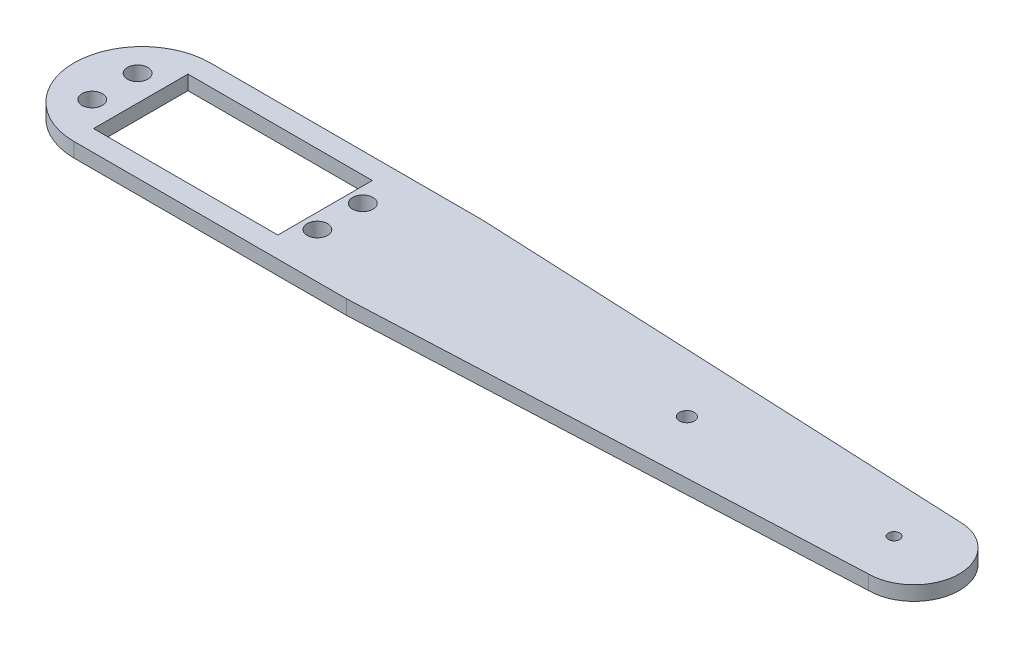
ISO-10303-21;
HEADER;
FILE_DESCRIPTION(('STEP AP214'),'2;1');
FILE_NAME('part.step','',(''),(''),'','','');
FILE_SCHEMA(('AUTOMOTIVE_DESIGN { 1 0 10303 214 1 1 1 1 }'));
ENDSEC;
DATA;
#1=APPLICATION_CONTEXT('core data for automotive mechanical design processes');
#2=APPLICATION_PROTOCOL_DEFINITION('international standard','automotive_design',2000,#1);
#3=PRODUCT_CONTEXT('',#1,'mechanical');
#4=PRODUCT('Part','Part','',(#3));
#5=PRODUCT_RELATED_PRODUCT_CATEGORY('part','',(#4));
#6=PRODUCT_DEFINITION_FORMATION('','',#4);
#7=PRODUCT_DEFINITION_CONTEXT('part definition',#1,'design');
#8=PRODUCT_DEFINITION('design','',#6,#7);
#9=PRODUCT_DEFINITION_SHAPE('','',#8);
#10=(LENGTH_UNIT() NAMED_UNIT(*) SI_UNIT(.MILLI.,.METRE.));
#11=(NAMED_UNIT(*) PLANE_ANGLE_UNIT() SI_UNIT($,.RADIAN.));
#12=(NAMED_UNIT(*) SI_UNIT($,.STERADIAN.) SOLID_ANGLE_UNIT());
#13=UNCERTAINTY_MEASURE_WITH_UNIT(LENGTH_MEASURE(1.E-05),#10,'distance_accuracy_value','');
#14=(GEOMETRIC_REPRESENTATION_CONTEXT(3) GLOBAL_UNCERTAINTY_ASSIGNED_CONTEXT((#13)) GLOBAL_UNIT_ASSIGNED_CONTEXT((#10,
#11,#12)) REPRESENTATION_CONTEXT('',''));
#15=CARTESIAN_POINT('',(0.,0.,0.));
#16=DIRECTION('',(0.,0.,1.));
#17=DIRECTION('',(1.,0.,0.));
#18=AXIS2_PLACEMENT_3D('',#15,#16,#17);
#19=CARTESIAN_POINT('',(-162.387355879804,3.175,-2.24465289077099));
#20=DIRECTION('',(0.,1.,0.));
#21=DIRECTION('',(0.,0.,1.));
#22=AXIS2_PLACEMENT_3D('',#19,#20,#21);
#23=PLANE('',#22);
#24=CARTESIAN_POINT('',(3.2376441201965,3.175,-2.24631068209401));
#25=DIRECTION('',(0.,1.,0.));
#26=DIRECTION('',(0.,0.,1.));
#27=AXIS2_PLACEMENT_3D('',#24,#25,#26);
#28=CIRCLE('',#27,1.25282432984258);
#29=CARTESIAN_POINT('',(3.2376441201965,3.175,-0.993486352251428));
#30=VERTEX_POINT('',#29);
#31=EDGE_CURVE('E283',#30,#30,#28,.T.);
#32=ORIENTED_EDGE('',*,*,#31,.F.);
#33=EDGE_LOOP('',(#32));
#34=FACE_BOUND('',#33,.T.);
#35=CARTESIAN_POINT('',(-118.787355879804,3.175,-7.24465289077099));
#36=DIRECTION('',(0.,1.,0.));
#37=DIRECTION('',(0.,0.,1.));
#38=AXIS2_PLACEMENT_3D('',#35,#36,#37);
#39=CIRCLE('',#38,2.25);
#40=CARTESIAN_POINT('',(-118.787355879804,3.175,-4.994652890771));
#41=VERTEX_POINT('',#40);
#42=EDGE_CURVE('E295',#41,#41,#39,.T.);
#43=ORIENTED_EDGE('',*,*,#42,.F.);
#44=EDGE_LOOP('',(#43));
#45=FACE_BOUND('',#44,.T.);
#46=CARTESIAN_POINT('',(-168.387355879804,3.175,2.75534710922901));
#47=DIRECTION('',(0.,1.,0.));
#48=DIRECTION('',(0.,0.,1.));
#49=AXIS2_PLACEMENT_3D('',#46,#47,#48);
#50=CIRCLE('',#49,2.25000000000001);
#51=CARTESIAN_POINT('',(-168.387355879804,3.175,5.00534710922902));
#52=VERTEX_POINT('',#51);
#53=EDGE_CURVE('E141',#52,#52,#50,.T.);
#54=ORIENTED_EDGE('',*,*,#53,.F.);
#55=EDGE_LOOP('',(#54));
#56=FACE_BOUND('',#55,.T.);
#57=CARTESIAN_POINT('',(-162.387355879804,3.175,-2.24465289077099));
#58=DIRECTION('',(0.,1.,0.));
#59=DIRECTION('',(0.,0.,1.));
#60=AXIS2_PLACEMENT_3D('',#57,#58,#59);
#61=CIRCLE('',#60,15.);
#62=CARTESIAN_POINT('',(-162.387355879804,3.175,-17.244652890771));
#63=VERTEX_POINT('',#62);
#64=CARTESIAN_POINT('',(-162.387355879804,3.175,12.755347109229));
#65=VERTEX_POINT('',#64);
#66=EDGE_CURVE('E151',#63,#65,#61,.T.);
#67=ORIENTED_EDGE('',*,*,#66,.T.);
#68=DIRECTION('',(1.,0.,0.));
#69=VECTOR('',#68,1.);
#70=CARTESIAN_POINT('',(-162.387355879804,3.175,12.755347109229));
#71=LINE('',#70,#69);
#72=CARTESIAN_POINT('',(-102.387355879804,3.175,12.755347109229));
#73=VERTEX_POINT('',#72);
#74=EDGE_CURVE('E154',#65,#73,#71,.T.);
#75=ORIENTED_EDGE('',*,*,#74,.T.);
#76=DIRECTION('',(0.9989685402103,0.,-0.04540766091865));
#77=VECTOR('',#76,1.);
#78=CARTESIAN_POINT('',(-102.387355879804,3.175,12.755347109229));
#79=LINE('',#78,#77);
#80=CARTESIAN_POINT('',(7.61264412019603,3.175,7.75534710922901));
#81=VERTEX_POINT('',#80);
#82=EDGE_CURVE('E157',#73,#81,#79,.T.);
#83=ORIENTED_EDGE('',*,*,#82,.T.);
#84=CARTESIAN_POINT('',(7.61264412019603,3.175,-2.24465289077099));
#85=DIRECTION('',(0.,1.,0.));
#86=DIRECTION('',(0.,0.,1.));
#87=AXIS2_PLACEMENT_3D('',#84,#85,#86);
#88=CIRCLE('',#87,10.);
#89=CARTESIAN_POINT('',(7.61264412019603,3.175,-12.244652890771));
#90=VERTEX_POINT('',#89);
#91=EDGE_CURVE('E159',#81,#90,#88,.T.);
#92=ORIENTED_EDGE('',*,*,#91,.T.);
#93=DIRECTION('',(-0.998968540210299,0.,-0.04540766091865));
#94=VECTOR('',#93,1.);
#95=CARTESIAN_POINT('',(-102.387355879804,3.175,-17.244652890771));
#96=LINE('',#95,#94);
#97=CARTESIAN_POINT('',(-102.387355879804,3.175,-17.244652890771));
#98=VERTEX_POINT('',#97);
#99=EDGE_CURVE('E161',#90,#98,#96,.T.);
#100=ORIENTED_EDGE('',*,*,#99,.T.);
#101=DIRECTION('',(-1.,0.,0.));
#102=VECTOR('',#101,1.);
#103=CARTESIAN_POINT('',(-162.387355879804,3.175,-17.244652890771));
#104=LINE('',#103,#102);
#105=EDGE_CURVE('E163',#98,#63,#104,.T.);
#106=ORIENTED_EDGE('',*,*,#105,.T.);
#107=EDGE_LOOP('',(#67,#75,#83,#92,#100,#106));
#108=FACE_BOUND('',#107,.T.);
#109=DIRECTION('',(1.,0.,0.));
#110=VECTOR('',#109,1.);
#111=CARTESIAN_POINT('',(-162.692621678717,3.175,8.15534710922901));
#112=LINE('',#111,#110);
#113=CARTESIAN_POINT('',(-162.692621678717,3.175,8.15534710922901));
#114=VERTEX_POINT('',#113);
#115=CARTESIAN_POINT('',(-122.092621678717,3.175,8.15534710922901));
#116=VERTEX_POINT('',#115);
#117=EDGE_CURVE('E120',#114,#116,#112,.T.);
#118=ORIENTED_EDGE('',*,*,#117,.F.);
#119=DIRECTION('',(0.,0.,1.));
#120=VECTOR('',#119,1.);
#121=CARTESIAN_POINT('',(-162.692621678717,3.175,8.15534710922901));
#122=LINE('',#121,#120);
#123=CARTESIAN_POINT('',(-162.692621678717,3.175,-12.644652890771));
#124=VERTEX_POINT('',#123);
#125=EDGE_CURVE('E112',#124,#114,#122,.T.);
#126=ORIENTED_EDGE('',*,*,#125,.F.);
#127=DIRECTION('',(-1.,0.,0.));
#128=VECTOR('',#127,1.);
#129=CARTESIAN_POINT('',(-162.692621678717,3.175,-12.644652890771));
#130=LINE('',#129,#128);
#131=CARTESIAN_POINT('',(-122.092621678717,3.175,-12.644652890771));
#132=VERTEX_POINT('',#131);
#133=EDGE_CURVE('E135',#132,#124,#130,.T.);
#134=ORIENTED_EDGE('',*,*,#133,.F.);
#135=DIRECTION('',(0.,0.,-1.));
#136=VECTOR('',#135,1.);
#137=CARTESIAN_POINT('',(-122.092621678717,3.175,8.15534710922901));
#138=LINE('',#137,#136);
#139=EDGE_CURVE('E133',#116,#132,#138,.T.);
#140=ORIENTED_EDGE('',*,*,#139,.F.);
#141=EDGE_LOOP('',(#118,#126,#134,#140));
#142=FACE_BOUND('',#141,.T.);
#143=CARTESIAN_POINT('',(-168.387355879804,3.175,-7.24465289077099));
#144=DIRECTION('',(0.,1.,0.));
#145=DIRECTION('',(0.,0.,1.));
#146=AXIS2_PLACEMENT_3D('',#143,#144,#145);
#147=CIRCLE('',#146,2.25000000000001);
#148=CARTESIAN_POINT('',(-168.387355879804,3.175,-4.99465289077098));
#149=VERTEX_POINT('',#148);
#150=EDGE_CURVE('E301',#149,#149,#147,.T.);
#151=ORIENTED_EDGE('',*,*,#150,.F.);
#152=EDGE_LOOP('',(#151));
#153=FACE_BOUND('',#152,.T.);
#154=CARTESIAN_POINT('',(-118.787355879804,3.175,2.75534710922901));
#155=DIRECTION('',(0.,1.,0.));
#156=DIRECTION('',(0.,0.,1.));
#157=AXIS2_PLACEMENT_3D('',#154,#155,#156);
#158=CIRCLE('',#157,2.25);
#159=CARTESIAN_POINT('',(-118.787355879804,3.175,5.00534710922901));
#160=VERTEX_POINT('',#159);
#161=EDGE_CURVE('E289',#160,#160,#158,.T.);
#162=ORIENTED_EDGE('',*,*,#161,.F.);
#163=EDGE_LOOP('',(#162));
#164=FACE_BOUND('',#163,.T.);
#165=CARTESIAN_POINT('',(-42.387355879804,3.175,-2.24465289077099));
#166=DIRECTION('',(0.,1.,0.));
#167=DIRECTION('',(0.,0.,1.));
#168=AXIS2_PLACEMENT_3D('',#165,#166,#167);
#169=CIRCLE('',#168,1.65);
#170=CARTESIAN_POINT('',(-42.387355879804,3.175,-0.594652890770989));
#171=VERTEX_POINT('',#170);
#172=EDGE_CURVE('E274',#171,#171,#169,.T.);
#173=ORIENTED_EDGE('',*,*,#172,.F.);
#174=EDGE_LOOP('',(#173));
#175=FACE_BOUND('',#174,.T.);
#176=ADVANCED_FACE('F35',(#34,#45,#56,#108,#142,#153,#164,#175),#23,.T.);
#177=CARTESIAN_POINT('',(-162.387355879804,0.,-2.24465289077099));
#178=DIRECTION('',(0.,1.,0.));
#179=DIRECTION('',(0.,0.,1.));
#180=AXIS2_PLACEMENT_3D('',#177,#178,#179);
#181=PLANE('',#180);
#182=CARTESIAN_POINT('',(-162.387355879804,0.,-2.24465289077099));
#183=DIRECTION('',(0.,1.,0.));
#184=DIRECTION('',(0.,0.,1.));
#185=AXIS2_PLACEMENT_3D('',#182,#183,#184);
#186=CIRCLE('',#185,15.);
#187=CARTESIAN_POINT('',(-162.387355879804,0.,-17.244652890771));
#188=VERTEX_POINT('',#187);
#189=CARTESIAN_POINT('',(-162.387355879804,0.,12.755347109229));
#190=VERTEX_POINT('',#189);
#191=EDGE_CURVE('E128',#188,#190,#186,.T.);
#192=ORIENTED_EDGE('',*,*,#191,.F.);
#193=DIRECTION('',(-1.,0.,0.));
#194=VECTOR('',#193,1.);
#195=CARTESIAN_POINT('',(-162.387355879804,0.,-17.244652890771));
#196=LINE('',#195,#194);
#197=CARTESIAN_POINT('',(-102.387355879804,0.,-17.244652890771));
#198=VERTEX_POINT('',#197);
#199=EDGE_CURVE('E155',#198,#188,#196,.T.);
#200=ORIENTED_EDGE('',*,*,#199,.F.);
#201=DIRECTION('',(-0.998968540210299,0.,-0.04540766091865));
#202=VECTOR('',#201,1.);
#203=CARTESIAN_POINT('',(-102.387355879804,0.,-17.244652890771));
#204=LINE('',#203,#202);
#205=CARTESIAN_POINT('',(7.61264412019603,0.,-12.244652890771));
#206=VERTEX_POINT('',#205);
#207=EDGE_CURVE('E174',#206,#198,#204,.T.);
#208=ORIENTED_EDGE('',*,*,#207,.F.);
#209=CARTESIAN_POINT('',(7.61264412019603,0.,-2.24465289077099));
#210=DIRECTION('',(0.,1.,0.));
#211=DIRECTION('',(0.,0.,1.));
#212=AXIS2_PLACEMENT_3D('',#209,#210,#211);
#213=CIRCLE('',#212,10.);
#214=CARTESIAN_POINT('',(7.61264412019603,0.,7.75534710922901));
#215=VERTEX_POINT('',#214);
#216=EDGE_CURVE('E172',#215,#206,#213,.T.);
#217=ORIENTED_EDGE('',*,*,#216,.F.);
#218=DIRECTION('',(0.9989685402103,0.,-0.04540766091865));
#219=VECTOR('',#218,1.);
#220=CARTESIAN_POINT('',(-102.387355879804,0.,12.755347109229));
#221=LINE('',#220,#219);
#222=CARTESIAN_POINT('',(-102.387355879804,0.,12.755347109229));
#223=VERTEX_POINT('',#222);
#224=EDGE_CURVE('E170',#223,#215,#221,.T.);
#225=ORIENTED_EDGE('',*,*,#224,.F.);
#226=DIRECTION('',(1.,0.,0.));
#227=VECTOR('',#226,1.);
#228=CARTESIAN_POINT('',(-162.387355879804,0.,12.755347109229));
#229=LINE('',#228,#227);
#230=EDGE_CURVE('E168',#190,#223,#229,.T.);
#231=ORIENTED_EDGE('',*,*,#230,.F.);
#232=EDGE_LOOP('',(#192,#200,#208,#217,#225,#231));
#233=FACE_BOUND('',#232,.T.);
#234=DIRECTION('',(0.,0.,1.));
#235=VECTOR('',#234,1.);
#236=CARTESIAN_POINT('',(-162.692621678717,0.,8.15534710922901));
#237=LINE('',#236,#235);
#238=CARTESIAN_POINT('',(-162.692621678717,0.,-12.644652890771));
#239=VERTEX_POINT('',#238);
#240=CARTESIAN_POINT('',(-162.692621678717,0.,8.15534710922901));
#241=VERTEX_POINT('',#240);
#242=EDGE_CURVE('E58',#239,#241,#237,.T.);
#243=ORIENTED_EDGE('',*,*,#242,.T.);
#244=DIRECTION('',(1.,0.,0.));
#245=VECTOR('',#244,1.);
#246=CARTESIAN_POINT('',(-162.692621678717,0.,8.15534710922901));
#247=LINE('',#246,#245);
#248=CARTESIAN_POINT('',(-122.092621678717,0.,8.15534710922901));
#249=VERTEX_POINT('',#248);
#250=EDGE_CURVE('E127',#241,#249,#247,.T.);
#251=ORIENTED_EDGE('',*,*,#250,.T.);
#252=DIRECTION('',(0.,0.,-1.));
#253=VECTOR('',#252,1.);
#254=CARTESIAN_POINT('',(-122.092621678717,0.,8.15534710922901));
#255=LINE('',#254,#253);
#256=CARTESIAN_POINT('',(-122.092621678717,0.,-12.644652890771));
#257=VERTEX_POINT('',#256);
#258=EDGE_CURVE('E143',#249,#257,#255,.T.);
#259=ORIENTED_EDGE('',*,*,#258,.T.);
#260=DIRECTION('',(-1.,0.,0.));
#261=VECTOR('',#260,1.);
#262=CARTESIAN_POINT('',(-162.692621678717,0.,-12.644652890771));
#263=LINE('',#262,#261);
#264=EDGE_CURVE('E121',#257,#239,#263,.T.);
#265=ORIENTED_EDGE('',*,*,#264,.T.);
#266=EDGE_LOOP('',(#243,#251,#259,#265));
#267=FACE_BOUND('',#266,.T.);
#268=CARTESIAN_POINT('',(-168.387355879804,0.,2.75534710922901));
#269=DIRECTION('',(0.,1.,0.));
#270=DIRECTION('',(0.,0.,1.));
#271=AXIS2_PLACEMENT_3D('',#268,#269,#270);
#272=CIRCLE('',#271,2.25000000000001);
#273=CARTESIAN_POINT('',(-168.387355879804,0.,5.00534710922902));
#274=VERTEX_POINT('',#273);
#275=EDGE_CURVE('E304',#274,#274,#272,.T.);
#276=ORIENTED_EDGE('',*,*,#275,.T.);
#277=EDGE_LOOP('',(#276));
#278=FACE_BOUND('',#277,.T.);
#279=CARTESIAN_POINT('',(-168.387355879804,0.,-7.24465289077099));
#280=DIRECTION('',(0.,1.,0.));
#281=DIRECTION('',(0.,0.,1.));
#282=AXIS2_PLACEMENT_3D('',#279,#280,#281);
#283=CIRCLE('',#282,2.25000000000001);
#284=CARTESIAN_POINT('',(-168.387355879804,0.,-4.99465289077098));
#285=VERTEX_POINT('',#284);
#286=EDGE_CURVE('E298',#285,#285,#283,.T.);
#287=ORIENTED_EDGE('',*,*,#286,.T.);
#288=EDGE_LOOP('',(#287));
#289=FACE_BOUND('',#288,.T.);
#290=CARTESIAN_POINT('',(-118.787355879804,0.,-7.24465289077099));
#291=DIRECTION('',(0.,1.,0.));
#292=DIRECTION('',(0.,0.,1.));
#293=AXIS2_PLACEMENT_3D('',#290,#291,#292);
#294=CIRCLE('',#293,2.25);
#295=CARTESIAN_POINT('',(-118.787355879804,0.,-4.994652890771));
#296=VERTEX_POINT('',#295);
#297=EDGE_CURVE('E292',#296,#296,#294,.T.);
#298=ORIENTED_EDGE('',*,*,#297,.T.);
#299=EDGE_LOOP('',(#298));
#300=FACE_BOUND('',#299,.T.);
#301=CARTESIAN_POINT('',(-118.787355879804,0.,2.75534710922901));
#302=DIRECTION('',(0.,1.,0.));
#303=DIRECTION('',(0.,0.,1.));
#304=AXIS2_PLACEMENT_3D('',#301,#302,#303);
#305=CIRCLE('',#304,2.25);
#306=CARTESIAN_POINT('',(-118.787355879804,0.,5.00534710922901));
#307=VERTEX_POINT('',#306);
#308=EDGE_CURVE('E286',#307,#307,#305,.T.);
#309=ORIENTED_EDGE('',*,*,#308,.T.);
#310=EDGE_LOOP('',(#309));
#311=FACE_BOUND('',#310,.T.);
#312=CARTESIAN_POINT('',(3.2376441201965,0.,-2.24631068209401));
#313=DIRECTION('',(0.,1.,0.));
#314=DIRECTION('',(0.,0.,1.));
#315=AXIS2_PLACEMENT_3D('',#312,#313,#314);
#316=CIRCLE('',#315,1.25282432984258);
#317=CARTESIAN_POINT('',(3.2376441201965,0.,-0.993486352251428));
#318=VERTEX_POINT('',#317);
#319=EDGE_CURVE('E280',#318,#318,#316,.T.);
#320=ORIENTED_EDGE('',*,*,#319,.T.);
#321=EDGE_LOOP('',(#320));
#322=FACE_BOUND('',#321,.T.);
#323=CARTESIAN_POINT('',(-42.387355879804,0.,-2.24465289077099));
#324=DIRECTION('',(0.,1.,0.));
#325=DIRECTION('',(0.,0.,1.));
#326=AXIS2_PLACEMENT_3D('',#323,#324,#325);
#327=CIRCLE('',#326,1.65);
#328=CARTESIAN_POINT('',(-42.387355879804,0.,-0.594652890770989));
#329=VERTEX_POINT('',#328);
#330=EDGE_CURVE('E277',#329,#329,#327,.T.);
#331=ORIENTED_EDGE('',*,*,#330,.T.);
#332=EDGE_LOOP('',(#331));
#333=FACE_BOUND('',#332,.T.);
#334=ADVANCED_FACE('F198',(#233,#267,#278,#289,#300,#311,#322,#333),#181,.F.);
#335=CARTESIAN_POINT('',(-162.387355879804,3.175,-2.24465289077099));
#336=DIRECTION('',(0.,-1.,0.));
#337=DIRECTION('',(0.,0.,-1.));
#338=AXIS2_PLACEMENT_3D('',#335,#336,#337);
#339=CYLINDRICAL_SURFACE('',#338,15.);
#340=ORIENTED_EDGE('',*,*,#191,.T.);
#341=DIRECTION('',(0.,-1.,0.));
#342=VECTOR('',#341,1.);
#343=CARTESIAN_POINT('',(-162.387355879804,3.175,12.755347109229));
#344=LINE('',#343,#342);
#345=EDGE_CURVE('E11',#65,#190,#344,.T.);
#346=ORIENTED_EDGE('',*,*,#345,.F.);
#347=ORIENTED_EDGE('',*,*,#66,.F.);
#348=DIRECTION('',(0.,-1.,0.));
#349=VECTOR('',#348,1.);
#350=CARTESIAN_POINT('',(-162.387355879804,3.175,-17.244652890771));
#351=LINE('',#350,#349);
#352=EDGE_CURVE('E165',#63,#188,#351,.T.);
#353=ORIENTED_EDGE('',*,*,#352,.T.);
#354=EDGE_LOOP('',(#340,#346,#347,#353));
#355=FACE_BOUND('',#354,.T.);
#356=ADVANCED_FACE('F37',(#355),#339,.T.);
#357=CARTESIAN_POINT('',(-162.387355879804,3.175,12.755347109229));
#358=DIRECTION('',(0.,0.,-1.));
#359=DIRECTION('',(-1.,0.,0.));
#360=AXIS2_PLACEMENT_3D('',#357,#358,#359);
#361=PLANE('',#360);
#362=ORIENTED_EDGE('',*,*,#230,.T.);
#363=DIRECTION('',(0.,-1.,0.));
#364=VECTOR('',#363,1.);
#365=CARTESIAN_POINT('',(-102.387355879804,3.175,12.755347109229));
#366=LINE('',#365,#364);
#367=EDGE_CURVE('E43',#73,#223,#366,.T.);
#368=ORIENTED_EDGE('',*,*,#367,.F.);
#369=ORIENTED_EDGE('',*,*,#74,.F.);
#370=ORIENTED_EDGE('',*,*,#345,.T.);
#371=EDGE_LOOP('',(#362,#368,#369,#370));
#372=FACE_BOUND('',#371,.T.);
#373=ADVANCED_FACE('F215',(#372),#361,.F.);
#374=CARTESIAN_POINT('',(-102.387355879804,3.175,12.755347109229));
#375=DIRECTION('',(-0.04540766091865,0.,-0.9989685402103));
#376=DIRECTION('',(-0.9989685402103,0.,0.04540766091865));
#377=AXIS2_PLACEMENT_3D('',#374,#375,#376);
#378=PLANE('',#377);
#379=ORIENTED_EDGE('',*,*,#224,.T.);
#380=DIRECTION('',(0.,-1.,0.));
#381=VECTOR('',#380,1.);
#382=CARTESIAN_POINT('',(7.61264412019603,3.175,7.75534710922901));
#383=LINE('',#382,#381);
#384=EDGE_CURVE('E185',#81,#215,#383,.T.);
#385=ORIENTED_EDGE('',*,*,#384,.F.);
#386=ORIENTED_EDGE('',*,*,#82,.F.);
#387=ORIENTED_EDGE('',*,*,#367,.T.);
#388=EDGE_LOOP('',(#379,#385,#386,#387));
#389=FACE_BOUND('',#388,.T.);
#390=ADVANCED_FACE('F192',(#389),#378,.F.);
#391=CARTESIAN_POINT('',(7.61264412019603,3.175,-2.24465289077099));
#392=DIRECTION('',(0.,-1.,0.));
#393=DIRECTION('',(0.,0.,-1.));
#394=AXIS2_PLACEMENT_3D('',#391,#392,#393);
#395=CYLINDRICAL_SURFACE('',#394,10.);
#396=ORIENTED_EDGE('',*,*,#216,.T.);
#397=DIRECTION('',(0.,-1.,0.));
#398=VECTOR('',#397,1.);
#399=CARTESIAN_POINT('',(7.61264412019603,3.175,-12.244652890771));
#400=LINE('',#399,#398);
#401=EDGE_CURVE('E182',#90,#206,#400,.T.);
#402=ORIENTED_EDGE('',*,*,#401,.F.);
#403=ORIENTED_EDGE('',*,*,#91,.F.);
#404=ORIENTED_EDGE('',*,*,#384,.T.);
#405=EDGE_LOOP('',(#396,#402,#403,#404));
#406=FACE_BOUND('',#405,.T.);
#407=ADVANCED_FACE('F204',(#406),#395,.T.);
#408=CARTESIAN_POINT('',(-102.387355879804,3.175,-17.244652890771));
#409=DIRECTION('',(-0.04540766091865,0.,0.9989685402103));
#410=DIRECTION('',(0.9989685402103,0.,0.04540766091865));
#411=AXIS2_PLACEMENT_3D('',#408,#409,#410);
#412=PLANE('',#411);
#413=ORIENTED_EDGE('',*,*,#207,.T.);
#414=DIRECTION('',(0.,-1.,0.));
#415=VECTOR('',#414,1.);
#416=CARTESIAN_POINT('',(-102.387355879804,3.175,-17.244652890771));
#417=LINE('',#416,#415);
#418=EDGE_CURVE('E179',#98,#198,#417,.T.);
#419=ORIENTED_EDGE('',*,*,#418,.F.);
#420=ORIENTED_EDGE('',*,*,#99,.F.);
#421=ORIENTED_EDGE('',*,*,#401,.T.);
#422=EDGE_LOOP('',(#413,#419,#420,#421));
#423=FACE_BOUND('',#422,.T.);
#424=ADVANCED_FACE('F208',(#423),#412,.F.);
#425=CARTESIAN_POINT('',(-162.387355879804,3.175,-17.244652890771));
#426=DIRECTION('',(0.,0.,1.));
#427=DIRECTION('',(1.,0.,0.));
#428=AXIS2_PLACEMENT_3D('',#425,#426,#427);
#429=PLANE('',#428);
#430=ORIENTED_EDGE('',*,*,#199,.T.);
#431=ORIENTED_EDGE('',*,*,#352,.F.);
#432=ORIENTED_EDGE('',*,*,#105,.F.);
#433=ORIENTED_EDGE('',*,*,#418,.T.);
#434=EDGE_LOOP('',(#430,#431,#432,#433));
#435=FACE_BOUND('',#434,.T.);
#436=ADVANCED_FACE('F218',(#435),#429,.F.);
#437=CARTESIAN_POINT('',(-162.692621678717,3.175,8.15534710922901));
#438=DIRECTION('',(1.,0.,0.));
#439=DIRECTION('',(0.,0.,-1.));
#440=AXIS2_PLACEMENT_3D('',#437,#438,#439);
#441=PLANE('',#440);
#442=ORIENTED_EDGE('',*,*,#242,.F.);
#443=DIRECTION('',(0.,-1.,0.));
#444=VECTOR('',#443,1.);
#445=CARTESIAN_POINT('',(-162.692621678717,3.175,-12.644652890771));
#446=LINE('',#445,#444);
#447=EDGE_CURVE('E116',#124,#239,#446,.T.);
#448=ORIENTED_EDGE('',*,*,#447,.F.);
#449=ORIENTED_EDGE('',*,*,#125,.T.);
#450=DIRECTION('',(0.,-1.,0.));
#451=VECTOR('',#450,1.);
#452=CARTESIAN_POINT('',(-162.692621678717,3.175,8.15534710922901));
#453=LINE('',#452,#451);
#454=EDGE_CURVE('E115',#114,#241,#453,.T.);
#455=ORIENTED_EDGE('',*,*,#454,.T.);
#456=EDGE_LOOP('',(#442,#448,#449,#455));
#457=FACE_BOUND('',#456,.T.);
#458=ADVANCED_FACE('F114',(#457),#441,.T.);
#459=CARTESIAN_POINT('',(-162.692621678717,3.175,8.15534710922901));
#460=DIRECTION('',(0.,0.,-1.));
#461=DIRECTION('',(-1.,0.,0.));
#462=AXIS2_PLACEMENT_3D('',#459,#460,#461);
#463=PLANE('',#462);
#464=ORIENTED_EDGE('',*,*,#250,.F.);
#465=ORIENTED_EDGE('',*,*,#454,.F.);
#466=ORIENTED_EDGE('',*,*,#117,.T.);
#467=DIRECTION('',(0.,-1.,0.));
#468=VECTOR('',#467,1.);
#469=CARTESIAN_POINT('',(-122.092621678717,3.175,8.15534710922901));
#470=LINE('',#469,#468);
#471=EDGE_CURVE('E129',#116,#249,#470,.T.);
#472=ORIENTED_EDGE('',*,*,#471,.T.);
#473=EDGE_LOOP('',(#464,#465,#466,#472));
#474=FACE_BOUND('',#473,.T.);
#475=ADVANCED_FACE('F124',(#474),#463,.T.);
#476=CARTESIAN_POINT('',(-122.092621678717,3.175,8.15534710922901));
#477=DIRECTION('',(-1.,0.,0.));
#478=DIRECTION('',(0.,0.,1.));
#479=AXIS2_PLACEMENT_3D('',#476,#477,#478);
#480=PLANE('',#479);
#481=ORIENTED_EDGE('',*,*,#258,.F.);
#482=ORIENTED_EDGE('',*,*,#471,.F.);
#483=ORIENTED_EDGE('',*,*,#139,.T.);
#484=DIRECTION('',(0.,-1.,0.));
#485=VECTOR('',#484,1.);
#486=CARTESIAN_POINT('',(-122.092621678717,3.175,-12.644652890771));
#487=LINE('',#486,#485);
#488=EDGE_CURVE('E50',#132,#257,#487,.T.);
#489=ORIENTED_EDGE('',*,*,#488,.T.);
#490=EDGE_LOOP('',(#481,#482,#483,#489));
#491=FACE_BOUND('',#490,.T.);
#492=ADVANCED_FACE('F239',(#491),#480,.T.);
#493=CARTESIAN_POINT('',(-162.692621678717,3.175,-12.644652890771));
#494=DIRECTION('',(0.,0.,1.));
#495=DIRECTION('',(1.,0.,0.));
#496=AXIS2_PLACEMENT_3D('',#493,#494,#495);
#497=PLANE('',#496);
#498=ORIENTED_EDGE('',*,*,#264,.F.);
#499=ORIENTED_EDGE('',*,*,#488,.F.);
#500=ORIENTED_EDGE('',*,*,#133,.T.);
#501=ORIENTED_EDGE('',*,*,#447,.T.);
#502=EDGE_LOOP('',(#498,#499,#500,#501));
#503=FACE_BOUND('',#502,.T.);
#504=ADVANCED_FACE('F242',(#503),#497,.T.);
#505=CARTESIAN_POINT('',(-168.387355879804,3.175,2.75534710922901));
#506=DIRECTION('',(0.,-1.,0.));
#507=DIRECTION('',(0.,0.,-1.));
#508=AXIS2_PLACEMENT_3D('',#505,#506,#507);
#509=CYLINDRICAL_SURFACE('',#508,2.25000000000001);
#510=ORIENTED_EDGE('',*,*,#53,.T.);
#511=EDGE_LOOP('',(#510));
#512=FACE_BOUND('',#511,.T.);
#513=ORIENTED_EDGE('',*,*,#275,.F.);
#514=EDGE_LOOP('',(#513));
#515=FACE_BOUND('',#514,.T.);
#516=ADVANCED_FACE('F246',(#512,#515),#509,.F.);
#517=CARTESIAN_POINT('',(-168.387355879804,3.175,-7.24465289077099));
#518=DIRECTION('',(0.,-1.,0.));
#519=DIRECTION('',(0.,0.,-1.));
#520=AXIS2_PLACEMENT_3D('',#517,#518,#519);
#521=CYLINDRICAL_SURFACE('',#520,2.25000000000001);
#522=ORIENTED_EDGE('',*,*,#150,.T.);
#523=EDGE_LOOP('',(#522));
#524=FACE_BOUND('',#523,.T.);
#525=ORIENTED_EDGE('',*,*,#286,.F.);
#526=EDGE_LOOP('',(#525));
#527=FACE_BOUND('',#526,.T.);
#528=ADVANCED_FACE('F249',(#524,#527),#521,.F.);
#529=CARTESIAN_POINT('',(-118.787355879804,3.175,-7.24465289077099));
#530=DIRECTION('',(0.,-1.,0.));
#531=DIRECTION('',(0.,0.,-1.));
#532=AXIS2_PLACEMENT_3D('',#529,#530,#531);
#533=CYLINDRICAL_SURFACE('',#532,2.25);
#534=ORIENTED_EDGE('',*,*,#42,.T.);
#535=EDGE_LOOP('',(#534));
#536=FACE_BOUND('',#535,.T.);
#537=ORIENTED_EDGE('',*,*,#297,.F.);
#538=EDGE_LOOP('',(#537));
#539=FACE_BOUND('',#538,.T.);
#540=ADVANCED_FACE('F253',(#536,#539),#533,.F.);
#541=CARTESIAN_POINT('',(-118.787355879804,3.175,2.75534710922901));
#542=DIRECTION('',(0.,-1.,0.));
#543=DIRECTION('',(0.,0.,-1.));
#544=AXIS2_PLACEMENT_3D('',#541,#542,#543);
#545=CYLINDRICAL_SURFACE('',#544,2.25);
#546=ORIENTED_EDGE('',*,*,#161,.T.);
#547=EDGE_LOOP('',(#546));
#548=FACE_BOUND('',#547,.T.);
#549=ORIENTED_EDGE('',*,*,#308,.F.);
#550=EDGE_LOOP('',(#549));
#551=FACE_BOUND('',#550,.T.);
#552=ADVANCED_FACE('F257',(#548,#551),#545,.F.);
#553=CARTESIAN_POINT('',(3.2376441201965,3.175,-2.24631068209401));
#554=DIRECTION('',(0.,-1.,0.));
#555=DIRECTION('',(0.,0.,-1.));
#556=AXIS2_PLACEMENT_3D('',#553,#554,#555);
#557=CYLINDRICAL_SURFACE('',#556,1.25282432984258);
#558=ORIENTED_EDGE('',*,*,#31,.T.);
#559=EDGE_LOOP('',(#558));
#560=FACE_BOUND('',#559,.T.);
#561=ORIENTED_EDGE('',*,*,#319,.F.);
#562=EDGE_LOOP('',(#561));
#563=FACE_BOUND('',#562,.T.);
#564=ADVANCED_FACE('F261',(#560,#563),#557,.F.);
#565=CARTESIAN_POINT('',(-42.387355879804,3.175,-2.24465289077099));
#566=DIRECTION('',(0.,-1.,0.));
#567=DIRECTION('',(0.,0.,-1.));
#568=AXIS2_PLACEMENT_3D('',#565,#566,#567);
#569=CYLINDRICAL_SURFACE('',#568,1.65);
#570=ORIENTED_EDGE('',*,*,#172,.T.);
#571=EDGE_LOOP('',(#570));
#572=FACE_BOUND('',#571,.T.);
#573=ORIENTED_EDGE('',*,*,#330,.F.);
#574=EDGE_LOOP('',(#573));
#575=FACE_BOUND('',#574,.T.);
#576=ADVANCED_FACE('F265',(#572,#575),#569,.F.);
#577=CLOSED_SHELL('',(#176,#334,#356,#373,#390,#407,#424,#436,#458,#475,#492,#504,#516,#528,
#540,#552,#564,#576));
#578=MANIFOLD_SOLID_BREP('B2',#577);
#579=ADVANCED_BREP_SHAPE_REPRESENTATION('',(#18,#578),#14);
#580=SHAPE_DEFINITION_REPRESENTATION(#9,#579);
ENDSEC;
END-ISO-10303-21;
